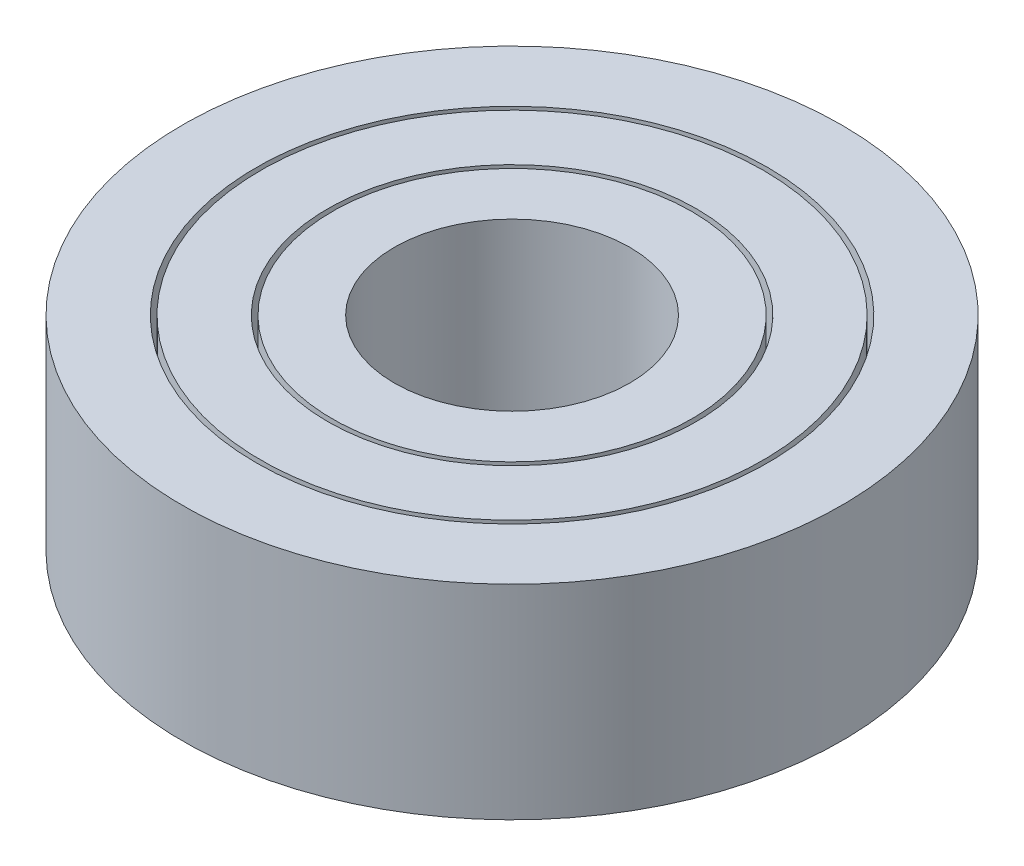
ISO-10303-21;
HEADER;
FILE_DESCRIPTION(('STEP AP214'),'2;1');
FILE_NAME('part.step','',(''),(''),'','','');
FILE_SCHEMA(('AUTOMOTIVE_DESIGN { 1 0 10303 214 1 1 1 1 }'));
ENDSEC;
DATA;
#1=APPLICATION_CONTEXT('core data for automotive mechanical design processes');
#2=APPLICATION_PROTOCOL_DEFINITION('international standard','automotive_design',2000,#1);
#3=PRODUCT_CONTEXT('',#1,'mechanical');
#4=PRODUCT('Part','Part','',(#3));
#5=PRODUCT_RELATED_PRODUCT_CATEGORY('part','',(#4));
#6=PRODUCT_DEFINITION_FORMATION('','',#4);
#7=PRODUCT_DEFINITION_CONTEXT('part definition',#1,'design');
#8=PRODUCT_DEFINITION('design','',#6,#7);
#9=PRODUCT_DEFINITION_SHAPE('','',#8);
#10=(LENGTH_UNIT() NAMED_UNIT(*) SI_UNIT(.MILLI.,.METRE.));
#11=(NAMED_UNIT(*) PLANE_ANGLE_UNIT() SI_UNIT($,.RADIAN.));
#12=(NAMED_UNIT(*) SI_UNIT($,.STERADIAN.) SOLID_ANGLE_UNIT());
#13=UNCERTAINTY_MEASURE_WITH_UNIT(LENGTH_MEASURE(1.E-05),#10,'distance_accuracy_value','');
#14=(GEOMETRIC_REPRESENTATION_CONTEXT(3) GLOBAL_UNCERTAINTY_ASSIGNED_CONTEXT((#13)) GLOBAL_UNIT_ASSIGNED_CONTEXT((#10,
#11,#12)) REPRESENTATION_CONTEXT('',''));
#15=CARTESIAN_POINT('',(0.,0.,0.));
#16=DIRECTION('',(0.,0.,1.));
#17=DIRECTION('',(1.,0.,0.));
#18=AXIS2_PLACEMENT_3D('',#15,#16,#17);
#19=CARTESIAN_POINT('',(0.,13.,0.));
#20=DIRECTION('',(0.,-1.,0.));
#21=DIRECTION('',(0.,0.,-1.));
#22=AXIS2_PLACEMENT_3D('',#19,#20,#21);
#23=CYLINDRICAL_SURFACE('',#22,7.5);
#24=CARTESIAN_POINT('',(0.,13.,0.));
#25=DIRECTION('',(0.,1.,0.));
#26=DIRECTION('',(0.,0.,1.));
#27=AXIS2_PLACEMENT_3D('',#24,#25,#26);
#28=CIRCLE('',#27,7.5);
#29=CARTESIAN_POINT('',(0.,13.,-7.5));
#30=VERTEX_POINT('',#29);
#31=EDGE_CURVE('E59',#30,#30,#28,.T.);
#32=CARTESIAN_POINT('',(0.,0.,0.));
#33=DIRECTION('',(0.,1.,0.));
#34=DIRECTION('',(0.,0.,1.));
#35=AXIS2_PLACEMENT_3D('',#32,#33,#34);
#36=CIRCLE('',#35,7.5);
#37=CARTESIAN_POINT('',(0.,0.,-7.5));
#38=VERTEX_POINT('',#37);
#39=EDGE_CURVE('E65',#38,#38,#36,.T.);
#40=CARTESIAN_POINT('',(0.,13.,-7.5));
#41=CARTESIAN_POINT('',(0.,12.8645833333333,-7.5));
#42=CARTESIAN_POINT('',(0.,12.7291666666667,-7.5));
#43=CARTESIAN_POINT('',(0.,12.4583333333333,-7.5));
#44=CARTESIAN_POINT('',(0.,12.3229166666667,-7.5));
#45=CARTESIAN_POINT('',(0.,12.0520833333333,-7.5));
#46=CARTESIAN_POINT('',(0.,11.9166666666667,-7.5));
#47=CARTESIAN_POINT('',(0.,11.6458333333333,-7.5));
#48=CARTESIAN_POINT('',(0.,11.5104166666667,-7.5));
#49=CARTESIAN_POINT('',(0.,11.2395833333333,-7.5));
#50=CARTESIAN_POINT('',(0.,11.1041666666667,-7.5));
#51=CARTESIAN_POINT('',(0.,10.8333333333333,-7.5));
#52=CARTESIAN_POINT('',(0.,10.6979166666667,-7.5));
#53=CARTESIAN_POINT('',(0.,10.4270833333333,-7.5));
#54=CARTESIAN_POINT('',(0.,10.2916666666667,-7.5));
#55=CARTESIAN_POINT('',(0.,10.0208333333333,-7.5));
#56=CARTESIAN_POINT('',(0.,9.88541666666667,-7.5));
#57=CARTESIAN_POINT('',(0.,9.61458333333333,-7.5));
#58=CARTESIAN_POINT('',(0.,9.47916666666667,-7.5));
#59=CARTESIAN_POINT('',(0.,9.20833333333333,-7.5));
#60=CARTESIAN_POINT('',(0.,9.07291666666666,-7.5));
#61=CARTESIAN_POINT('',(0.,8.80208333333333,-7.5));
#62=CARTESIAN_POINT('',(0.,8.66666666666667,-7.5));
#63=CARTESIAN_POINT('',(0.,8.39583333333333,-7.5));
#64=CARTESIAN_POINT('',(0.,8.26041666666667,-7.5));
#65=CARTESIAN_POINT('',(0.,7.98958333333333,-7.5));
#66=CARTESIAN_POINT('',(0.,7.85416666666667,-7.5));
#67=CARTESIAN_POINT('',(0.,7.58333333333333,-7.5));
#68=CARTESIAN_POINT('',(0.,7.44791666666667,-7.5));
#69=CARTESIAN_POINT('',(0.,7.17708333333333,-7.5));
#70=CARTESIAN_POINT('',(0.,7.04166666666667,-7.5));
#71=CARTESIAN_POINT('',(0.,6.77083333333333,-7.5));
#72=CARTESIAN_POINT('',(0.,6.63541666666667,-7.5));
#73=CARTESIAN_POINT('',(0.,6.36458333333333,-7.5));
#74=CARTESIAN_POINT('',(0.,6.22916666666667,-7.5));
#75=CARTESIAN_POINT('',(0.,5.95833333333333,-7.5));
#76=CARTESIAN_POINT('',(0.,5.82291666666667,-7.5));
#77=CARTESIAN_POINT('',(0.,5.55208333333333,-7.5));
#78=CARTESIAN_POINT('',(0.,5.41666666666667,-7.5));
#79=CARTESIAN_POINT('',(0.,5.14583333333333,-7.5));
#80=CARTESIAN_POINT('',(0.,5.01041666666667,-7.5));
#81=CARTESIAN_POINT('',(0.,4.73958333333333,-7.5));
#82=CARTESIAN_POINT('',(0.,4.60416666666667,-7.5));
#83=CARTESIAN_POINT('',(0.,4.33333333333333,-7.5));
#84=CARTESIAN_POINT('',(0.,4.19791666666667,-7.5));
#85=CARTESIAN_POINT('',(0.,3.92708333333333,-7.5));
#86=CARTESIAN_POINT('',(0.,3.79166666666667,-7.5));
#87=CARTESIAN_POINT('',(0.,3.52083333333333,-7.5));
#88=CARTESIAN_POINT('',(0.,3.38541666666667,-7.5));
#89=CARTESIAN_POINT('',(0.,3.11458333333333,-7.5));
#90=CARTESIAN_POINT('',(0.,2.97916666666667,-7.5));
#91=CARTESIAN_POINT('',(0.,2.70833333333333,-7.5));
#92=CARTESIAN_POINT('',(0.,2.57291666666667,-7.5));
#93=CARTESIAN_POINT('',(0.,2.30208333333333,-7.5));
#94=CARTESIAN_POINT('',(0.,2.16666666666667,-7.5));
#95=CARTESIAN_POINT('',(0.,1.89583333333333,-7.5));
#96=CARTESIAN_POINT('',(0.,1.76041666666667,-7.5));
#97=CARTESIAN_POINT('',(0.,1.48958333333333,-7.5));
#98=CARTESIAN_POINT('',(0.,1.35416666666667,-7.5));
#99=CARTESIAN_POINT('',(0.,1.08333333333333,-7.5));
#100=CARTESIAN_POINT('',(0.,0.947916666666667,-7.5));
#101=CARTESIAN_POINT('',(0.,0.677083333333334,-7.5));
#102=CARTESIAN_POINT('',(0.,0.541666666666667,-7.5));
#103=CARTESIAN_POINT('',(0.,0.270833333333334,-7.5));
#104=CARTESIAN_POINT('',(0.,0.135416666666667,-7.5));
#105=CARTESIAN_POINT('',(0.,0.,-7.5));
#106=B_SPLINE_CURVE_WITH_KNOTS('',3,(#40,#41,#42,#43,#44,#45,#46,#47,#48,#49,#50,#51,#52,#53,
#54,#55,#56,#57,#58,#59,#60,#61,#62,#63,#64,#65,#66,#67,#68,#69,#70,#71,#72,#73,#74,#75,#76,#77,
#78,#79,#80,#81,#82,#83,#84,#85,#86,#87,#88,#89,#90,#91,#92,#93,#94,#95,#96,#97,#98,#99,#100,
#101,#102,#103,#104,#105),.UNSPECIFIED.,.F.,.F.,(4,2,2,2,2,2,2,2,2,2,2,2,2,2,2,2,2,2,2,2,2,2,2,
2,2,2,2,2,2,2,2,2,4),(0.,0.40625,0.812500000000001,1.21875,1.625,2.03125,2.4375,2.84375,3.25,
3.65625,4.0625,4.46875,4.875,5.28125,5.6875,6.09375,6.5,6.90625,7.3125,7.71875,8.125,8.53125,
8.9375,9.34375,9.75,10.15625,10.5625,10.96875,11.375,11.78125,12.1875,12.59375,13.),.UNSPECIFIED.);
#107=EDGE_CURVE('BSEAM52',#30,#38,#106,.T.);
#108=ORIENTED_EDGE('',*,*,#31,.T.);
#109=ORIENTED_EDGE('',*,*,#39,.F.);
#110=ORIENTED_EDGE('',*,*,#107,.T.);
#111=ORIENTED_EDGE('',*,*,#107,.F.);
#112=EDGE_LOOP('',(#108,#110,#109,#111));
#113=FACE_BOUND('',#112,.T.);
#114=ADVANCED_FACE('F52',(#113),#23,.F.);
#115=CARTESIAN_POINT('',(0.,13.,0.));
#116=DIRECTION('',(0.,-1.,0.));
#117=DIRECTION('',(0.,0.,-1.));
#118=AXIS2_PLACEMENT_3D('',#115,#116,#117);
#119=CYLINDRICAL_SURFACE('',#118,11.45);
#120=CARTESIAN_POINT('',(0.,13.,0.));
#121=DIRECTION('',(0.,1.,0.));
#122=DIRECTION('',(0.,0.,1.));
#123=AXIS2_PLACEMENT_3D('',#120,#121,#122);
#124=CIRCLE('',#123,11.45);
#125=CARTESIAN_POINT('',(0.,13.,-11.45));
#126=VERTEX_POINT('',#125);
#127=EDGE_CURVE('E11',#126,#126,#124,.T.);
#128=CARTESIAN_POINT('',(0.,0.,0.));
#129=DIRECTION('',(0.,1.,0.));
#130=DIRECTION('',(0.,0.,1.));
#131=AXIS2_PLACEMENT_3D('',#128,#129,#130);
#132=CIRCLE('',#131,11.45);
#133=CARTESIAN_POINT('',(0.,0.,-11.45));
#134=VERTEX_POINT('',#133);
#135=EDGE_CURVE('E55',#134,#134,#132,.T.);
#136=CARTESIAN_POINT('',(0.,13.,-11.45));
#137=CARTESIAN_POINT('',(0.,12.8645833333333,-11.45));
#138=CARTESIAN_POINT('',(0.,12.7291666666667,-11.45));
#139=CARTESIAN_POINT('',(0.,12.4583333333333,-11.45));
#140=CARTESIAN_POINT('',(0.,12.3229166666667,-11.45));
#141=CARTESIAN_POINT('',(0.,12.0520833333333,-11.45));
#142=CARTESIAN_POINT('',(0.,11.9166666666667,-11.45));
#143=CARTESIAN_POINT('',(0.,11.6458333333333,-11.45));
#144=CARTESIAN_POINT('',(0.,11.5104166666667,-11.45));
#145=CARTESIAN_POINT('',(0.,11.2395833333333,-11.45));
#146=CARTESIAN_POINT('',(0.,11.1041666666667,-11.45));
#147=CARTESIAN_POINT('',(0.,10.8333333333333,-11.45));
#148=CARTESIAN_POINT('',(0.,10.6979166666667,-11.45));
#149=CARTESIAN_POINT('',(0.,10.4270833333333,-11.45));
#150=CARTESIAN_POINT('',(0.,10.2916666666667,-11.45));
#151=CARTESIAN_POINT('',(0.,10.0208333333333,-11.45));
#152=CARTESIAN_POINT('',(0.,9.88541666666667,-11.45));
#153=CARTESIAN_POINT('',(0.,9.61458333333333,-11.45));
#154=CARTESIAN_POINT('',(0.,9.47916666666667,-11.45));
#155=CARTESIAN_POINT('',(0.,9.20833333333333,-11.45));
#156=CARTESIAN_POINT('',(0.,9.07291666666667,-11.45));
#157=CARTESIAN_POINT('',(0.,8.80208333333333,-11.45));
#158=CARTESIAN_POINT('',(0.,8.66666666666667,-11.45));
#159=CARTESIAN_POINT('',(0.,8.39583333333333,-11.45));
#160=CARTESIAN_POINT('',(0.,8.26041666666667,-11.45));
#161=CARTESIAN_POINT('',(0.,7.98958333333333,-11.45));
#162=CARTESIAN_POINT('',(0.,7.85416666666667,-11.45));
#163=CARTESIAN_POINT('',(0.,7.58333333333333,-11.45));
#164=CARTESIAN_POINT('',(0.,7.44791666666667,-11.45));
#165=CARTESIAN_POINT('',(0.,7.17708333333333,-11.45));
#166=CARTESIAN_POINT('',(0.,7.04166666666667,-11.45));
#167=CARTESIAN_POINT('',(0.,6.77083333333333,-11.45));
#168=CARTESIAN_POINT('',(0.,6.63541666666667,-11.45));
#169=CARTESIAN_POINT('',(0.,6.36458333333333,-11.45));
#170=CARTESIAN_POINT('',(0.,6.22916666666667,-11.45));
#171=CARTESIAN_POINT('',(0.,5.95833333333333,-11.45));
#172=CARTESIAN_POINT('',(0.,5.82291666666667,-11.45));
#173=CARTESIAN_POINT('',(0.,5.55208333333333,-11.45));
#174=CARTESIAN_POINT('',(0.,5.41666666666667,-11.45));
#175=CARTESIAN_POINT('',(0.,5.14583333333333,-11.45));
#176=CARTESIAN_POINT('',(0.,5.01041666666667,-11.45));
#177=CARTESIAN_POINT('',(0.,4.73958333333333,-11.45));
#178=CARTESIAN_POINT('',(0.,4.60416666666667,-11.45));
#179=CARTESIAN_POINT('',(0.,4.33333333333333,-11.45));
#180=CARTESIAN_POINT('',(0.,4.19791666666667,-11.45));
#181=CARTESIAN_POINT('',(0.,3.92708333333333,-11.45));
#182=CARTESIAN_POINT('',(0.,3.79166666666667,-11.45));
#183=CARTESIAN_POINT('',(0.,3.52083333333333,-11.45));
#184=CARTESIAN_POINT('',(0.,3.38541666666667,-11.45));
#185=CARTESIAN_POINT('',(0.,3.11458333333333,-11.45));
#186=CARTESIAN_POINT('',(0.,2.97916666666667,-11.45));
#187=CARTESIAN_POINT('',(0.,2.70833333333333,-11.45));
#188=CARTESIAN_POINT('',(0.,2.57291666666667,-11.45));
#189=CARTESIAN_POINT('',(0.,2.30208333333333,-11.45));
#190=CARTESIAN_POINT('',(0.,2.16666666666667,-11.45));
#191=CARTESIAN_POINT('',(0.,1.89583333333333,-11.45));
#192=CARTESIAN_POINT('',(0.,1.76041666666667,-11.45));
#193=CARTESIAN_POINT('',(0.,1.48958333333333,-11.45));
#194=CARTESIAN_POINT('',(0.,1.35416666666667,-11.45));
#195=CARTESIAN_POINT('',(0.,1.08333333333333,-11.45));
#196=CARTESIAN_POINT('',(0.,0.947916666666667,-11.45));
#197=CARTESIAN_POINT('',(0.,0.677083333333334,-11.45));
#198=CARTESIAN_POINT('',(0.,0.541666666666667,-11.45));
#199=CARTESIAN_POINT('',(0.,0.270833333333334,-11.45));
#200=CARTESIAN_POINT('',(0.,0.135416666666667,-11.45));
#201=CARTESIAN_POINT('',(0.,0.,-11.45));
#202=B_SPLINE_CURVE_WITH_KNOTS('',3,(#136,#137,#138,#139,#140,#141,#142,#143,#144,#145,#146,
#147,#148,#149,#150,#151,#152,#153,#154,#155,#156,#157,#158,#159,#160,#161,#162,#163,#164,#165,
#166,#167,#168,#169,#170,#171,#172,#173,#174,#175,#176,#177,#178,#179,#180,#181,#182,#183,#184,
#185,#186,#187,#188,#189,#190,#191,#192,#193,#194,#195,#196,#197,#198,#199,#200,#201),
.UNSPECIFIED.,.F.,.F.,(4,2,2,2,2,2,2,2,2,2,2,2,2,2,2,2,2,2,2,2,2,2,2,2,2,2,2,2,2,2,2,2,4),(0.,
0.406249999999999,0.812499999999999,1.21875,1.625,2.03125,2.4375,2.84375,3.25,3.65625,4.0625,
4.46875,4.875,5.28125,5.6875,6.09375,6.5,6.90625,7.3125,7.71875,8.125,8.53125,8.9375,9.34375,
9.75,10.15625,10.5625,10.96875,11.375,11.78125,12.1875,12.59375,13.),.UNSPECIFIED.);
#203=EDGE_CURVE('BSEAM72',#126,#134,#202,.T.);
#204=ORIENTED_EDGE('',*,*,#127,.F.);
#205=ORIENTED_EDGE('',*,*,#135,.T.);
#206=ORIENTED_EDGE('',*,*,#203,.T.);
#207=ORIENTED_EDGE('',*,*,#203,.F.);
#208=EDGE_LOOP('',(#204,#206,#205,#207));
#209=FACE_BOUND('',#208,.T.);
#210=ADVANCED_FACE('F72',(#209),#119,.T.);
#211=CARTESIAN_POINT('',(0.,13.,0.));
#212=DIRECTION('',(0.,1.,0.));
#213=DIRECTION('',(0.,0.,1.));
#214=AXIS2_PLACEMENT_3D('',#211,#212,#213);
#215=PLANE('',#214);
#216=ORIENTED_EDGE('',*,*,#31,.F.);
#217=EDGE_LOOP('',(#216));
#218=FACE_BOUND('',#217,.T.);
#219=ORIENTED_EDGE('',*,*,#127,.T.);
#220=EDGE_LOOP('',(#219));
#221=FACE_BOUND('',#220,.T.);
#222=ADVANCED_FACE('F76',(#218,#221),#215,.T.);
#223=CARTESIAN_POINT('',(0.,0.,0.));
#224=DIRECTION('',(0.,1.,0.));
#225=DIRECTION('',(0.,0.,1.));
#226=AXIS2_PLACEMENT_3D('',#223,#224,#225);
#227=PLANE('',#226);
#228=ORIENTED_EDGE('',*,*,#39,.T.);
#229=EDGE_LOOP('',(#228));
#230=FACE_BOUND('',#229,.T.);
#231=ORIENTED_EDGE('',*,*,#135,.F.);
#232=EDGE_LOOP('',(#231));
#233=FACE_BOUND('',#232,.T.);
#234=ADVANCED_FACE('F74',(#230,#233),#227,.F.);
#235=CLOSED_SHELL('',(#114,#210,#222,#234));
#236=MANIFOLD_SOLID_BREP('B2',#235);
#237=CARTESIAN_POINT('',(0.,13.,0.));
#238=DIRECTION('',(0.,1.,0.));
#239=DIRECTION('',(0.,0.,1.));
#240=AXIS2_PLACEMENT_3D('',#237,#238,#239);
#241=PLANE('',#240);
#242=CARTESIAN_POINT('',(0.,13.,0.));
#243=DIRECTION('',(0.,1.,0.));
#244=DIRECTION('',(0.,0.,1.));
#245=AXIS2_PLACEMENT_3D('',#242,#243,#244);
#246=CIRCLE('',#245,16.);
#247=CARTESIAN_POINT('',(0.,13.,-16.));
#248=VERTEX_POINT('',#247);
#249=EDGE_CURVE('E51',#248,#248,#246,.T.);
#250=ORIENTED_EDGE('',*,*,#249,.T.);
#251=EDGE_LOOP('',(#250));
#252=FACE_BOUND('',#251,.T.);
#253=CARTESIAN_POINT('',(0.,13.,0.));
#254=DIRECTION('',(0.,1.,0.));
#255=DIRECTION('',(0.,0.,1.));
#256=AXIS2_PLACEMENT_3D('',#253,#254,#255);
#257=CIRCLE('',#256,11.75);
#258=CARTESIAN_POINT('',(0.,13.,-11.75));
#259=VERTEX_POINT('',#258);
#260=EDGE_CURVE('E140',#259,#259,#257,.T.);
#261=ORIENTED_EDGE('',*,*,#260,.F.);
#262=EDGE_LOOP('',(#261));
#263=FACE_BOUND('',#262,.T.);
#264=ADVANCED_FACE('F129',(#252,#263),#241,.T.);
#265=CARTESIAN_POINT('',(0.,0.,0.));
#266=DIRECTION('',(0.,1.,0.));
#267=DIRECTION('',(0.,0.,1.));
#268=AXIS2_PLACEMENT_3D('',#265,#266,#267);
#269=PLANE('',#268);
#270=CARTESIAN_POINT('',(0.,0.,0.));
#271=DIRECTION('',(0.,1.,0.));
#272=DIRECTION('',(0.,0.,1.));
#273=AXIS2_PLACEMENT_3D('',#270,#271,#272);
#274=CIRCLE('',#273,16.);
#275=CARTESIAN_POINT('',(0.,0.,-16.));
#276=VERTEX_POINT('',#275);
#277=EDGE_CURVE('E133',#276,#276,#274,.T.);
#278=ORIENTED_EDGE('',*,*,#277,.F.);
#279=EDGE_LOOP('',(#278));
#280=FACE_BOUND('',#279,.T.);
#281=CARTESIAN_POINT('',(0.,0.,0.));
#282=DIRECTION('',(0.,1.,0.));
#283=DIRECTION('',(0.,0.,1.));
#284=AXIS2_PLACEMENT_3D('',#281,#282,#283);
#285=CIRCLE('',#284,11.75);
#286=CARTESIAN_POINT('',(0.,0.,-11.75));
#287=VERTEX_POINT('',#286);
#288=EDGE_CURVE('E142',#287,#287,#285,.T.);
#289=ORIENTED_EDGE('',*,*,#288,.T.);
#290=EDGE_LOOP('',(#289));
#291=FACE_BOUND('',#290,.T.);
#292=ADVANCED_FACE('F152',(#280,#291),#269,.F.);
#293=CARTESIAN_POINT('',(0.,13.,0.));
#294=DIRECTION('',(0.,-1.,0.));
#295=DIRECTION('',(0.,0.,-1.));
#296=AXIS2_PLACEMENT_3D('',#293,#294,#295);
#297=CYLINDRICAL_SURFACE('',#296,16.);
#298=CARTESIAN_POINT('',(0.,13.,-16.));
#299=CARTESIAN_POINT('',(0.,12.8645833333333,-16.));
#300=CARTESIAN_POINT('',(0.,12.7291666666667,-16.));
#301=CARTESIAN_POINT('',(0.,12.4583333333333,-16.));
#302=CARTESIAN_POINT('',(0.,12.3229166666667,-16.));
#303=CARTESIAN_POINT('',(0.,12.0520833333333,-16.));
#304=CARTESIAN_POINT('',(0.,11.9166666666667,-16.));
#305=CARTESIAN_POINT('',(0.,11.6458333333333,-16.));
#306=CARTESIAN_POINT('',(0.,11.5104166666667,-16.));
#307=CARTESIAN_POINT('',(0.,11.2395833333333,-16.));
#308=CARTESIAN_POINT('',(0.,11.1041666666667,-16.));
#309=CARTESIAN_POINT('',(0.,10.8333333333333,-16.));
#310=CARTESIAN_POINT('',(0.,10.6979166666667,-16.));
#311=CARTESIAN_POINT('',(0.,10.4270833333333,-16.));
#312=CARTESIAN_POINT('',(0.,10.2916666666667,-16.));
#313=CARTESIAN_POINT('',(0.,10.0208333333333,-16.));
#314=CARTESIAN_POINT('',(0.,9.88541666666667,-16.));
#315=CARTESIAN_POINT('',(0.,9.61458333333333,-16.));
#316=CARTESIAN_POINT('',(0.,9.47916666666667,-16.));
#317=CARTESIAN_POINT('',(0.,9.20833333333333,-16.));
#318=CARTESIAN_POINT('',(0.,9.07291666666667,-16.));
#319=CARTESIAN_POINT('',(0.,8.80208333333333,-16.));
#320=CARTESIAN_POINT('',(0.,8.66666666666667,-16.));
#321=CARTESIAN_POINT('',(0.,8.39583333333333,-16.));
#322=CARTESIAN_POINT('',(0.,8.26041666666667,-16.));
#323=CARTESIAN_POINT('',(0.,7.98958333333333,-16.));
#324=CARTESIAN_POINT('',(0.,7.85416666666667,-16.));
#325=CARTESIAN_POINT('',(0.,7.58333333333333,-16.));
#326=CARTESIAN_POINT('',(0.,7.44791666666667,-16.));
#327=CARTESIAN_POINT('',(0.,7.17708333333333,-16.));
#328=CARTESIAN_POINT('',(0.,7.04166666666667,-16.));
#329=CARTESIAN_POINT('',(0.,6.77083333333333,-16.));
#330=CARTESIAN_POINT('',(0.,6.63541666666667,-16.));
#331=CARTESIAN_POINT('',(0.,6.36458333333333,-16.));
#332=CARTESIAN_POINT('',(0.,6.22916666666667,-16.));
#333=CARTESIAN_POINT('',(0.,5.95833333333333,-16.));
#334=CARTESIAN_POINT('',(0.,5.82291666666667,-16.));
#335=CARTESIAN_POINT('',(0.,5.55208333333333,-16.));
#336=CARTESIAN_POINT('',(0.,5.41666666666667,-16.));
#337=CARTESIAN_POINT('',(0.,5.14583333333333,-16.));
#338=CARTESIAN_POINT('',(0.,5.01041666666667,-16.));
#339=CARTESIAN_POINT('',(0.,4.73958333333333,-16.));
#340=CARTESIAN_POINT('',(0.,4.60416666666667,-16.));
#341=CARTESIAN_POINT('',(0.,4.33333333333333,-16.));
#342=CARTESIAN_POINT('',(0.,4.19791666666667,-16.));
#343=CARTESIAN_POINT('',(0.,3.92708333333333,-16.));
#344=CARTESIAN_POINT('',(0.,3.79166666666667,-16.));
#345=CARTESIAN_POINT('',(0.,3.52083333333333,-16.));
#346=CARTESIAN_POINT('',(0.,3.38541666666667,-16.));
#347=CARTESIAN_POINT('',(0.,3.11458333333333,-16.));
#348=CARTESIAN_POINT('',(0.,2.97916666666667,-16.));
#349=CARTESIAN_POINT('',(0.,2.70833333333333,-16.));
#350=CARTESIAN_POINT('',(0.,2.57291666666667,-16.));
#351=CARTESIAN_POINT('',(0.,2.30208333333333,-16.));
#352=CARTESIAN_POINT('',(0.,2.16666666666667,-16.));
#353=CARTESIAN_POINT('',(0.,1.89583333333333,-16.));
#354=CARTESIAN_POINT('',(0.,1.76041666666667,-16.));
#355=CARTESIAN_POINT('',(0.,1.48958333333333,-16.));
#356=CARTESIAN_POINT('',(0.,1.35416666666667,-16.));
#357=CARTESIAN_POINT('',(0.,1.08333333333333,-16.));
#358=CARTESIAN_POINT('',(0.,0.947916666666667,-16.));
#359=CARTESIAN_POINT('',(0.,0.677083333333334,-16.));
#360=CARTESIAN_POINT('',(0.,0.541666666666667,-16.));
#361=CARTESIAN_POINT('',(0.,0.270833333333334,-16.));
#362=CARTESIAN_POINT('',(0.,0.135416666666667,-16.));
#363=CARTESIAN_POINT('',(0.,0.,-16.));
#364=B_SPLINE_CURVE_WITH_KNOTS('',3,(#298,#299,#300,#301,#302,#303,#304,#305,#306,#307,#308,
#309,#310,#311,#312,#313,#314,#315,#316,#317,#318,#319,#320,#321,#322,#323,#324,#325,#326,#327,
#328,#329,#330,#331,#332,#333,#334,#335,#336,#337,#338,#339,#340,#341,#342,#343,#344,#345,#346,
#347,#348,#349,#350,#351,#352,#353,#354,#355,#356,#357,#358,#359,#360,#361,#362,#363),
.UNSPECIFIED.,.F.,.F.,(4,2,2,2,2,2,2,2,2,2,2,2,2,2,2,2,2,2,2,2,2,2,2,2,2,2,2,2,2,2,2,2,4),(0.,
0.406249999999999,0.812499999999999,1.21875,1.625,2.03125,2.4375,2.84375,3.25,3.65625,4.0625,
4.46875,4.875,5.28125,5.6875,6.09375,6.5,6.90625,7.3125,7.71875,8.125,8.53125,8.9375,9.34375,
9.75,10.15625,10.5625,10.96875,11.375,11.78125,12.1875,12.59375,13.),.UNSPECIFIED.);
#365=EDGE_CURVE('BSEAM131',#248,#276,#364,.T.);
#366=ORIENTED_EDGE('',*,*,#249,.F.);
#367=ORIENTED_EDGE('',*,*,#277,.T.);
#368=ORIENTED_EDGE('',*,*,#365,.T.);
#369=ORIENTED_EDGE('',*,*,#365,.F.);
#370=EDGE_LOOP('',(#366,#368,#367,#369));
#371=FACE_BOUND('',#370,.T.);
#372=ADVANCED_FACE('F131',(#371),#297,.T.);
#373=CARTESIAN_POINT('',(0.,13.,0.));
#374=DIRECTION('',(0.,-1.,0.));
#375=DIRECTION('',(0.,0.,-1.));
#376=AXIS2_PLACEMENT_3D('',#373,#374,#375);
#377=CYLINDRICAL_SURFACE('',#376,11.75);
#378=CARTESIAN_POINT('',(0.,13.,-11.75));
#379=CARTESIAN_POINT('',(0.,12.8645833333333,-11.75));
#380=CARTESIAN_POINT('',(0.,12.7291666666667,-11.75));
#381=CARTESIAN_POINT('',(0.,12.4583333333333,-11.75));
#382=CARTESIAN_POINT('',(0.,12.3229166666667,-11.75));
#383=CARTESIAN_POINT('',(0.,12.0520833333333,-11.75));
#384=CARTESIAN_POINT('',(0.,11.9166666666667,-11.75));
#385=CARTESIAN_POINT('',(0.,11.6458333333333,-11.75));
#386=CARTESIAN_POINT('',(0.,11.5104166666667,-11.75));
#387=CARTESIAN_POINT('',(0.,11.2395833333333,-11.75));
#388=CARTESIAN_POINT('',(0.,11.1041666666667,-11.75));
#389=CARTESIAN_POINT('',(0.,10.8333333333333,-11.75));
#390=CARTESIAN_POINT('',(0.,10.6979166666667,-11.75));
#391=CARTESIAN_POINT('',(0.,10.4270833333333,-11.75));
#392=CARTESIAN_POINT('',(0.,10.2916666666667,-11.75));
#393=CARTESIAN_POINT('',(0.,10.0208333333333,-11.75));
#394=CARTESIAN_POINT('',(0.,9.88541666666667,-11.75));
#395=CARTESIAN_POINT('',(0.,9.61458333333333,-11.75));
#396=CARTESIAN_POINT('',(0.,9.47916666666667,-11.75));
#397=CARTESIAN_POINT('',(0.,9.20833333333333,-11.75));
#398=CARTESIAN_POINT('',(0.,9.07291666666666,-11.75));
#399=CARTESIAN_POINT('',(0.,8.80208333333333,-11.75));
#400=CARTESIAN_POINT('',(0.,8.66666666666667,-11.75));
#401=CARTESIAN_POINT('',(0.,8.39583333333333,-11.75));
#402=CARTESIAN_POINT('',(0.,8.26041666666667,-11.75));
#403=CARTESIAN_POINT('',(0.,7.98958333333333,-11.75));
#404=CARTESIAN_POINT('',(0.,7.85416666666667,-11.75));
#405=CARTESIAN_POINT('',(0.,7.58333333333333,-11.75));
#406=CARTESIAN_POINT('',(0.,7.44791666666667,-11.75));
#407=CARTESIAN_POINT('',(0.,7.17708333333333,-11.75));
#408=CARTESIAN_POINT('',(0.,7.04166666666667,-11.75));
#409=CARTESIAN_POINT('',(0.,6.77083333333333,-11.75));
#410=CARTESIAN_POINT('',(0.,6.63541666666667,-11.75));
#411=CARTESIAN_POINT('',(0.,6.36458333333333,-11.75));
#412=CARTESIAN_POINT('',(0.,6.22916666666667,-11.75));
#413=CARTESIAN_POINT('',(0.,5.95833333333333,-11.75));
#414=CARTESIAN_POINT('',(0.,5.82291666666667,-11.75));
#415=CARTESIAN_POINT('',(0.,5.55208333333333,-11.75));
#416=CARTESIAN_POINT('',(0.,5.41666666666667,-11.75));
#417=CARTESIAN_POINT('',(0.,5.14583333333333,-11.75));
#418=CARTESIAN_POINT('',(0.,5.01041666666667,-11.75));
#419=CARTESIAN_POINT('',(0.,4.73958333333333,-11.75));
#420=CARTESIAN_POINT('',(0.,4.60416666666667,-11.75));
#421=CARTESIAN_POINT('',(0.,4.33333333333333,-11.75));
#422=CARTESIAN_POINT('',(0.,4.19791666666667,-11.75));
#423=CARTESIAN_POINT('',(0.,3.92708333333333,-11.75));
#424=CARTESIAN_POINT('',(0.,3.79166666666667,-11.75));
#425=CARTESIAN_POINT('',(0.,3.52083333333333,-11.75));
#426=CARTESIAN_POINT('',(0.,3.38541666666667,-11.75));
#427=CARTESIAN_POINT('',(0.,3.11458333333333,-11.75));
#428=CARTESIAN_POINT('',(0.,2.97916666666667,-11.75));
#429=CARTESIAN_POINT('',(0.,2.70833333333333,-11.75));
#430=CARTESIAN_POINT('',(0.,2.57291666666667,-11.75));
#431=CARTESIAN_POINT('',(0.,2.30208333333333,-11.75));
#432=CARTESIAN_POINT('',(0.,2.16666666666667,-11.75));
#433=CARTESIAN_POINT('',(0.,1.89583333333333,-11.75));
#434=CARTESIAN_POINT('',(0.,1.76041666666667,-11.75));
#435=CARTESIAN_POINT('',(0.,1.48958333333333,-11.75));
#436=CARTESIAN_POINT('',(0.,1.35416666666667,-11.75));
#437=CARTESIAN_POINT('',(0.,1.08333333333333,-11.75));
#438=CARTESIAN_POINT('',(0.,0.947916666666667,-11.75));
#439=CARTESIAN_POINT('',(0.,0.677083333333334,-11.75));
#440=CARTESIAN_POINT('',(0.,0.541666666666667,-11.75));
#441=CARTESIAN_POINT('',(0.,0.270833333333334,-11.75));
#442=CARTESIAN_POINT('',(0.,0.135416666666667,-11.75));
#443=CARTESIAN_POINT('',(0.,0.,-11.75));
#444=B_SPLINE_CURVE_WITH_KNOTS('',3,(#378,#379,#380,#381,#382,#383,#384,#385,#386,#387,#388,
#389,#390,#391,#392,#393,#394,#395,#396,#397,#398,#399,#400,#401,#402,#403,#404,#405,#406,#407,
#408,#409,#410,#411,#412,#413,#414,#415,#416,#417,#418,#419,#420,#421,#422,#423,#424,#425,#426,
#427,#428,#429,#430,#431,#432,#433,#434,#435,#436,#437,#438,#439,#440,#441,#442,#443),
.UNSPECIFIED.,.F.,.F.,(4,2,2,2,2,2,2,2,2,2,2,2,2,2,2,2,2,2,2,2,2,2,2,2,2,2,2,2,2,2,2,2,4),(0.,
0.40625,0.812500000000001,1.21875,1.625,2.03125,2.4375,2.84375,3.25,3.65625,4.0625,4.46875,
4.875,5.28125,5.6875,6.09375,6.5,6.90625,7.3125,7.71875,8.125,8.53125,8.9375,9.34375,9.75,
10.15625,10.5625,10.96875,11.375,11.78125,12.1875,12.59375,13.),.UNSPECIFIED.);
#445=EDGE_CURVE('BSEAM148',#259,#287,#444,.T.);
#446=ORIENTED_EDGE('',*,*,#260,.T.);
#447=ORIENTED_EDGE('',*,*,#288,.F.);
#448=ORIENTED_EDGE('',*,*,#445,.T.);
#449=ORIENTED_EDGE('',*,*,#445,.F.);
#450=EDGE_LOOP('',(#446,#448,#447,#449));
#451=FACE_BOUND('',#450,.T.);
#452=ADVANCED_FACE('F148',(#451),#377,.F.);
#453=CLOSED_SHELL('',(#264,#292,#372,#452));
#454=MANIFOLD_SOLID_BREP('B6',#453);
#455=CARTESIAN_POINT('',(0.,13.,0.));
#456=DIRECTION('',(0.,-1.,0.));
#457=DIRECTION('',(0.,0.,-1.));
#458=AXIS2_PLACEMENT_3D('',#455,#456,#457);
#459=CYLINDRICAL_SURFACE('',#458,16.3);
#460=CARTESIAN_POINT('',(0.,13.,0.));
#461=DIRECTION('',(0.,1.,0.));
#462=DIRECTION('',(0.,0.,1.));
#463=AXIS2_PLACEMENT_3D('',#460,#461,#462);
#464=CIRCLE('',#463,16.3);
#465=CARTESIAN_POINT('',(0.,13.,-16.3));
#466=VERTEX_POINT('',#465);
#467=EDGE_CURVE('E207',#466,#466,#464,.T.);
#468=CARTESIAN_POINT('',(0.,0.,0.));
#469=DIRECTION('',(0.,1.,0.));
#470=DIRECTION('',(0.,0.,1.));
#471=AXIS2_PLACEMENT_3D('',#468,#469,#470);
#472=CIRCLE('',#471,16.3);
#473=CARTESIAN_POINT('',(0.,0.,-16.3));
#474=VERTEX_POINT('',#473);
#475=EDGE_CURVE('E214',#474,#474,#472,.T.);
#476=CARTESIAN_POINT('',(0.,13.,-16.3));
#477=CARTESIAN_POINT('',(0.,12.8645833333333,-16.3));
#478=CARTESIAN_POINT('',(0.,12.7291666666667,-16.3));
#479=CARTESIAN_POINT('',(0.,12.4583333333333,-16.3));
#480=CARTESIAN_POINT('',(0.,12.3229166666667,-16.3));
#481=CARTESIAN_POINT('',(0.,12.0520833333333,-16.3));
#482=CARTESIAN_POINT('',(0.,11.9166666666667,-16.3));
#483=CARTESIAN_POINT('',(0.,11.6458333333333,-16.3));
#484=CARTESIAN_POINT('',(0.,11.5104166666667,-16.3));
#485=CARTESIAN_POINT('',(0.,11.2395833333333,-16.3));
#486=CARTESIAN_POINT('',(0.,11.1041666666667,-16.3));
#487=CARTESIAN_POINT('',(0.,10.8333333333333,-16.3));
#488=CARTESIAN_POINT('',(0.,10.6979166666667,-16.3));
#489=CARTESIAN_POINT('',(0.,10.4270833333333,-16.3));
#490=CARTESIAN_POINT('',(0.,10.2916666666667,-16.3));
#491=CARTESIAN_POINT('',(0.,10.0208333333333,-16.3));
#492=CARTESIAN_POINT('',(0.,9.88541666666667,-16.3));
#493=CARTESIAN_POINT('',(0.,9.61458333333333,-16.3));
#494=CARTESIAN_POINT('',(0.,9.47916666666667,-16.3));
#495=CARTESIAN_POINT('',(0.,9.20833333333333,-16.3));
#496=CARTESIAN_POINT('',(0.,9.07291666666667,-16.3));
#497=CARTESIAN_POINT('',(0.,8.80208333333333,-16.3));
#498=CARTESIAN_POINT('',(0.,8.66666666666667,-16.3));
#499=CARTESIAN_POINT('',(0.,8.39583333333333,-16.3));
#500=CARTESIAN_POINT('',(0.,8.26041666666667,-16.3));
#501=CARTESIAN_POINT('',(0.,7.98958333333333,-16.3));
#502=CARTESIAN_POINT('',(0.,7.85416666666667,-16.3));
#503=CARTESIAN_POINT('',(0.,7.58333333333333,-16.3));
#504=CARTESIAN_POINT('',(0.,7.44791666666667,-16.3));
#505=CARTESIAN_POINT('',(0.,7.17708333333333,-16.3));
#506=CARTESIAN_POINT('',(0.,7.04166666666667,-16.3));
#507=CARTESIAN_POINT('',(0.,6.77083333333333,-16.3));
#508=CARTESIAN_POINT('',(0.,6.63541666666667,-16.3));
#509=CARTESIAN_POINT('',(0.,6.36458333333333,-16.3));
#510=CARTESIAN_POINT('',(0.,6.22916666666667,-16.3));
#511=CARTESIAN_POINT('',(0.,5.95833333333333,-16.3));
#512=CARTESIAN_POINT('',(0.,5.82291666666667,-16.3));
#513=CARTESIAN_POINT('',(0.,5.55208333333333,-16.3));
#514=CARTESIAN_POINT('',(0.,5.41666666666667,-16.3));
#515=CARTESIAN_POINT('',(0.,5.14583333333333,-16.3));
#516=CARTESIAN_POINT('',(0.,5.01041666666667,-16.3));
#517=CARTESIAN_POINT('',(0.,4.73958333333333,-16.3));
#518=CARTESIAN_POINT('',(0.,4.60416666666667,-16.3));
#519=CARTESIAN_POINT('',(0.,4.33333333333333,-16.3));
#520=CARTESIAN_POINT('',(0.,4.19791666666667,-16.3));
#521=CARTESIAN_POINT('',(0.,3.92708333333333,-16.3));
#522=CARTESIAN_POINT('',(0.,3.79166666666667,-16.3));
#523=CARTESIAN_POINT('',(0.,3.52083333333333,-16.3));
#524=CARTESIAN_POINT('',(0.,3.38541666666667,-16.3));
#525=CARTESIAN_POINT('',(0.,3.11458333333333,-16.3));
#526=CARTESIAN_POINT('',(0.,2.97916666666667,-16.3));
#527=CARTESIAN_POINT('',(0.,2.70833333333333,-16.3));
#528=CARTESIAN_POINT('',(0.,2.57291666666667,-16.3));
#529=CARTESIAN_POINT('',(0.,2.30208333333333,-16.3));
#530=CARTESIAN_POINT('',(0.,2.16666666666667,-16.3));
#531=CARTESIAN_POINT('',(0.,1.89583333333333,-16.3));
#532=CARTESIAN_POINT('',(0.,1.76041666666667,-16.3));
#533=CARTESIAN_POINT('',(0.,1.48958333333333,-16.3));
#534=CARTESIAN_POINT('',(0.,1.35416666666667,-16.3));
#535=CARTESIAN_POINT('',(0.,1.08333333333333,-16.3));
#536=CARTESIAN_POINT('',(0.,0.947916666666667,-16.3));
#537=CARTESIAN_POINT('',(0.,0.677083333333334,-16.3));
#538=CARTESIAN_POINT('',(0.,0.541666666666667,-16.3));
#539=CARTESIAN_POINT('',(0.,0.270833333333334,-16.3));
#540=CARTESIAN_POINT('',(0.,0.135416666666667,-16.3));
#541=CARTESIAN_POINT('',(0.,0.,-16.3));
#542=B_SPLINE_CURVE_WITH_KNOTS('',3,(#476,#477,#478,#479,#480,#481,#482,#483,#484,#485,#486,
#487,#488,#489,#490,#491,#492,#493,#494,#495,#496,#497,#498,#499,#500,#501,#502,#503,#504,#505,
#506,#507,#508,#509,#510,#511,#512,#513,#514,#515,#516,#517,#518,#519,#520,#521,#522,#523,#524,
#525,#526,#527,#528,#529,#530,#531,#532,#533,#534,#535,#536,#537,#538,#539,#540,#541),
.UNSPECIFIED.,.F.,.F.,(4,2,2,2,2,2,2,2,2,2,2,2,2,2,2,2,2,2,2,2,2,2,2,2,2,2,2,2,2,2,2,2,4),(0.,
0.406249999999999,0.812499999999999,1.21875,1.625,2.03125,2.4375,2.84375,3.25,3.65625,4.0625,
4.46875,4.875,5.28125,5.6875,6.09375,6.5,6.90625,7.3125,7.71875,8.125,8.53125,8.9375,9.34375,
9.75,10.15625,10.5625,10.96875,11.375,11.78125,12.1875,12.59375,13.),.UNSPECIFIED.);
#543=EDGE_CURVE('BSEAM199',#466,#474,#542,.T.);
#544=ORIENTED_EDGE('',*,*,#467,.T.);
#545=ORIENTED_EDGE('',*,*,#475,.F.);
#546=ORIENTED_EDGE('',*,*,#543,.T.);
#547=ORIENTED_EDGE('',*,*,#543,.F.);
#548=EDGE_LOOP('',(#544,#546,#545,#547));
#549=FACE_BOUND('',#548,.T.);
#550=ADVANCED_FACE('F199',(#549),#459,.F.);
#551=CARTESIAN_POINT('',(0.,13.,0.));
#552=DIRECTION('',(0.,-1.,0.));
#553=DIRECTION('',(0.,0.,-1.));
#554=AXIS2_PLACEMENT_3D('',#551,#552,#553);
#555=CYLINDRICAL_SURFACE('',#554,21.);
#556=CARTESIAN_POINT('',(0.,13.,0.));
#557=DIRECTION('',(0.,1.,0.));
#558=DIRECTION('',(0.,0.,1.));
#559=AXIS2_PLACEMENT_3D('',#556,#557,#558);
#560=CIRCLE('',#559,21.);
#561=CARTESIAN_POINT('',(0.,13.,-21.));
#562=VERTEX_POINT('',#561);
#563=EDGE_CURVE('E128',#562,#562,#560,.T.);
#564=CARTESIAN_POINT('',(0.,0.,0.));
#565=DIRECTION('',(0.,1.,0.));
#566=DIRECTION('',(0.,0.,1.));
#567=AXIS2_PLACEMENT_3D('',#564,#565,#566);
#568=CIRCLE('',#567,21.);
#569=CARTESIAN_POINT('',(0.,0.,-21.));
#570=VERTEX_POINT('',#569);
#571=EDGE_CURVE('E202',#570,#570,#568,.T.);
#572=CARTESIAN_POINT('',(0.,13.,-21.));
#573=CARTESIAN_POINT('',(0.,12.8645833333333,-21.));
#574=CARTESIAN_POINT('',(0.,12.7291666666667,-21.));
#575=CARTESIAN_POINT('',(0.,12.4583333333333,-21.));
#576=CARTESIAN_POINT('',(0.,12.3229166666667,-21.));
#577=CARTESIAN_POINT('',(0.,12.0520833333333,-21.));
#578=CARTESIAN_POINT('',(0.,11.9166666666667,-21.));
#579=CARTESIAN_POINT('',(0.,11.6458333333333,-21.));
#580=CARTESIAN_POINT('',(0.,11.5104166666667,-21.));
#581=CARTESIAN_POINT('',(0.,11.2395833333333,-21.));
#582=CARTESIAN_POINT('',(0.,11.1041666666667,-21.));
#583=CARTESIAN_POINT('',(0.,10.8333333333333,-21.));
#584=CARTESIAN_POINT('',(0.,10.6979166666667,-21.));
#585=CARTESIAN_POINT('',(0.,10.4270833333333,-21.));
#586=CARTESIAN_POINT('',(0.,10.2916666666667,-21.));
#587=CARTESIAN_POINT('',(0.,10.0208333333333,-21.));
#588=CARTESIAN_POINT('',(0.,9.88541666666667,-21.));
#589=CARTESIAN_POINT('',(0.,9.61458333333333,-21.));
#590=CARTESIAN_POINT('',(0.,9.47916666666667,-21.));
#591=CARTESIAN_POINT('',(0.,9.20833333333333,-21.));
#592=CARTESIAN_POINT('',(0.,9.07291666666667,-21.));
#593=CARTESIAN_POINT('',(0.,8.80208333333333,-21.));
#594=CARTESIAN_POINT('',(0.,8.66666666666667,-21.));
#595=CARTESIAN_POINT('',(0.,8.39583333333333,-21.));
#596=CARTESIAN_POINT('',(0.,8.26041666666667,-21.));
#597=CARTESIAN_POINT('',(0.,7.98958333333333,-21.));
#598=CARTESIAN_POINT('',(0.,7.85416666666667,-21.));
#599=CARTESIAN_POINT('',(0.,7.58333333333333,-21.));
#600=CARTESIAN_POINT('',(0.,7.44791666666667,-21.));
#601=CARTESIAN_POINT('',(0.,7.17708333333333,-21.));
#602=CARTESIAN_POINT('',(0.,7.04166666666667,-21.));
#603=CARTESIAN_POINT('',(0.,6.77083333333333,-21.));
#604=CARTESIAN_POINT('',(0.,6.63541666666667,-21.));
#605=CARTESIAN_POINT('',(0.,6.36458333333333,-21.));
#606=CARTESIAN_POINT('',(0.,6.22916666666667,-21.));
#607=CARTESIAN_POINT('',(0.,5.95833333333333,-21.));
#608=CARTESIAN_POINT('',(0.,5.82291666666667,-21.));
#609=CARTESIAN_POINT('',(0.,5.55208333333333,-21.));
#610=CARTESIAN_POINT('',(0.,5.41666666666667,-21.));
#611=CARTESIAN_POINT('',(0.,5.14583333333333,-21.));
#612=CARTESIAN_POINT('',(0.,5.01041666666667,-21.));
#613=CARTESIAN_POINT('',(0.,4.73958333333333,-21.));
#614=CARTESIAN_POINT('',(0.,4.60416666666667,-21.));
#615=CARTESIAN_POINT('',(0.,4.33333333333333,-21.));
#616=CARTESIAN_POINT('',(0.,4.19791666666667,-21.));
#617=CARTESIAN_POINT('',(0.,3.92708333333333,-21.));
#618=CARTESIAN_POINT('',(0.,3.79166666666667,-21.));
#619=CARTESIAN_POINT('',(0.,3.52083333333333,-21.));
#620=CARTESIAN_POINT('',(0.,3.38541666666667,-21.));
#621=CARTESIAN_POINT('',(0.,3.11458333333333,-21.));
#622=CARTESIAN_POINT('',(0.,2.97916666666667,-21.));
#623=CARTESIAN_POINT('',(0.,2.70833333333333,-21.));
#624=CARTESIAN_POINT('',(0.,2.57291666666667,-21.));
#625=CARTESIAN_POINT('',(0.,2.30208333333333,-21.));
#626=CARTESIAN_POINT('',(0.,2.16666666666667,-21.));
#627=CARTESIAN_POINT('',(0.,1.89583333333333,-21.));
#628=CARTESIAN_POINT('',(0.,1.76041666666667,-21.));
#629=CARTESIAN_POINT('',(0.,1.48958333333333,-21.));
#630=CARTESIAN_POINT('',(0.,1.35416666666667,-21.));
#631=CARTESIAN_POINT('',(0.,1.08333333333333,-21.));
#632=CARTESIAN_POINT('',(0.,0.947916666666667,-21.));
#633=CARTESIAN_POINT('',(0.,0.677083333333334,-21.));
#634=CARTESIAN_POINT('',(0.,0.541666666666667,-21.));
#635=CARTESIAN_POINT('',(0.,0.270833333333334,-21.));
#636=CARTESIAN_POINT('',(0.,0.135416666666667,-21.));
#637=CARTESIAN_POINT('',(0.,0.,-21.));
#638=B_SPLINE_CURVE_WITH_KNOTS('',3,(#572,#573,#574,#575,#576,#577,#578,#579,#580,#581,#582,
#583,#584,#585,#586,#587,#588,#589,#590,#591,#592,#593,#594,#595,#596,#597,#598,#599,#600,#601,
#602,#603,#604,#605,#606,#607,#608,#609,#610,#611,#612,#613,#614,#615,#616,#617,#618,#619,#620,
#621,#622,#623,#624,#625,#626,#627,#628,#629,#630,#631,#632,#633,#634,#635,#636,#637),
.UNSPECIFIED.,.F.,.F.,(4,2,2,2,2,2,2,2,2,2,2,2,2,2,2,2,2,2,2,2,2,2,2,2,2,2,2,2,2,2,2,2,4),(0.,
0.406249999999999,0.812499999999999,1.21875,1.625,2.03125,2.4375,2.84375,3.25,3.65625,4.0625,
4.46875,4.875,5.28125,5.6875,6.09375,6.5,6.90625,7.3125,7.71875,8.125,8.53125,8.9375,9.34375,
9.75,10.15625,10.5625,10.96875,11.375,11.78125,12.1875,12.59375,13.),.UNSPECIFIED.);
#639=EDGE_CURVE('BSEAM223',#562,#570,#638,.T.);
#640=ORIENTED_EDGE('',*,*,#563,.F.);
#641=ORIENTED_EDGE('',*,*,#571,.T.);
#642=ORIENTED_EDGE('',*,*,#639,.T.);
#643=ORIENTED_EDGE('',*,*,#639,.F.);
#644=EDGE_LOOP('',(#640,#642,#641,#643));
#645=FACE_BOUND('',#644,.T.);
#646=ADVANCED_FACE('F223',(#645),#555,.T.);
#647=CARTESIAN_POINT('',(0.,13.,0.));
#648=DIRECTION('',(0.,1.,0.));
#649=DIRECTION('',(0.,0.,1.));
#650=AXIS2_PLACEMENT_3D('',#647,#648,#649);
#651=PLANE('',#650);
#652=ORIENTED_EDGE('',*,*,#467,.F.);
#653=EDGE_LOOP('',(#652));
#654=FACE_BOUND('',#653,.T.);
#655=ORIENTED_EDGE('',*,*,#563,.T.);
#656=EDGE_LOOP('',(#655));
#657=FACE_BOUND('',#656,.T.);
#658=ADVANCED_FACE('F227',(#654,#657),#651,.T.);
#659=CARTESIAN_POINT('',(0.,0.,0.));
#660=DIRECTION('',(0.,1.,0.));
#661=DIRECTION('',(0.,0.,1.));
#662=AXIS2_PLACEMENT_3D('',#659,#660,#661);
#663=PLANE('',#662);
#664=ORIENTED_EDGE('',*,*,#475,.T.);
#665=EDGE_LOOP('',(#664));
#666=FACE_BOUND('',#665,.T.);
#667=ORIENTED_EDGE('',*,*,#571,.F.);
#668=EDGE_LOOP('',(#667));
#669=FACE_BOUND('',#668,.T.);
#670=ADVANCED_FACE('F225',(#666,#669),#663,.F.);
#671=CLOSED_SHELL('',(#550,#646,#658,#670));
#672=MANIFOLD_SOLID_BREP('B46',#671);
#673=ADVANCED_BREP_SHAPE_REPRESENTATION('',(#18,#236,#454,#672),#14);
#674=SHAPE_DEFINITION_REPRESENTATION(#9,#673);
ENDSEC;
END-ISO-10303-21;
